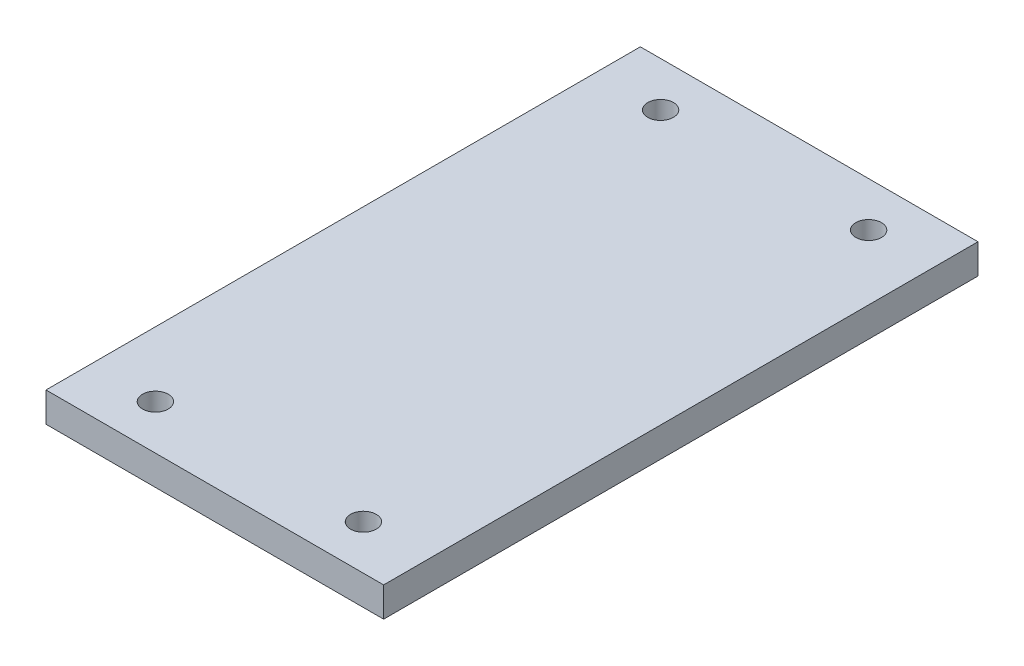
ISO-10303-21;
HEADER;
FILE_DESCRIPTION(('STEP AP214'),'2;1');
FILE_NAME('part.step','',(''),(''),'','','');
FILE_SCHEMA(('AUTOMOTIVE_DESIGN { 1 0 10303 214 1 1 1 1 }'));
ENDSEC;
DATA;
#1=APPLICATION_CONTEXT('core data for automotive mechanical design processes');
#2=APPLICATION_PROTOCOL_DEFINITION('international standard','automotive_design',2000,#1);
#3=PRODUCT_CONTEXT('',#1,'mechanical');
#4=PRODUCT('Part','Part','',(#3));
#5=PRODUCT_RELATED_PRODUCT_CATEGORY('part','',(#4));
#6=PRODUCT_DEFINITION_FORMATION('','',#4);
#7=PRODUCT_DEFINITION_CONTEXT('part definition',#1,'design');
#8=PRODUCT_DEFINITION('design','',#6,#7);
#9=PRODUCT_DEFINITION_SHAPE('','',#8);
#10=(LENGTH_UNIT() NAMED_UNIT(*) SI_UNIT(.MILLI.,.METRE.));
#11=(NAMED_UNIT(*) PLANE_ANGLE_UNIT() SI_UNIT($,.RADIAN.));
#12=(NAMED_UNIT(*) SI_UNIT($,.STERADIAN.) SOLID_ANGLE_UNIT());
#13=UNCERTAINTY_MEASURE_WITH_UNIT(LENGTH_MEASURE(1.E-05),#10,'distance_accuracy_value','');
#14=(GEOMETRIC_REPRESENTATION_CONTEXT(3) GLOBAL_UNCERTAINTY_ASSIGNED_CONTEXT((#13)) GLOBAL_UNIT_ASSIGNED_CONTEXT((#10,
#11,#12)) REPRESENTATION_CONTEXT('',''));
#15=CARTESIAN_POINT('',(0.,0.,0.));
#16=DIRECTION('',(0.,0.,1.));
#17=DIRECTION('',(1.,0.,0.));
#18=AXIS2_PLACEMENT_3D('',#15,#16,#17);
#19=CARTESIAN_POINT('',(36.071859276,6.35,63.5));
#20=DIRECTION('',(-1.,0.,0.));
#21=DIRECTION('',(0.,0.,1.));
#22=AXIS2_PLACEMENT_3D('',#19,#20,#21);
#23=PLANE('',#22);
#24=DIRECTION('',(0.,0.,-1.));
#25=VECTOR('',#24,1.);
#26=CARTESIAN_POINT('',(36.071859276,0.,63.5));
#27=LINE('',#26,#25);
#28=CARTESIAN_POINT('',(36.071859276,0.,63.5));
#29=VERTEX_POINT('',#28);
#30=CARTESIAN_POINT('',(36.071859276,0.,-63.5));
#31=VERTEX_POINT('',#30);
#32=EDGE_CURVE('E100',#29,#31,#27,.T.);
#33=ORIENTED_EDGE('',*,*,#32,.T.);
#34=DIRECTION('',(0.,-1.,0.));
#35=VECTOR('',#34,1.);
#36=CARTESIAN_POINT('',(36.071859276,6.35,-63.5));
#37=LINE('',#36,#35);
#38=CARTESIAN_POINT('',(36.071859276,6.35,-63.5));
#39=VERTEX_POINT('',#38);
#40=EDGE_CURVE('E11',#39,#31,#37,.T.);
#41=ORIENTED_EDGE('',*,*,#40,.F.);
#42=DIRECTION('',(0.,0.,-1.));
#43=VECTOR('',#42,1.);
#44=CARTESIAN_POINT('',(36.071859276,6.35,63.5));
#45=LINE('',#44,#43);
#46=CARTESIAN_POINT('',(36.071859276,6.35,63.5));
#47=VERTEX_POINT('',#46);
#48=EDGE_CURVE('E88',#47,#39,#45,.T.);
#49=ORIENTED_EDGE('',*,*,#48,.F.);
#50=DIRECTION('',(0.,-1.,0.));
#51=VECTOR('',#50,1.);
#52=CARTESIAN_POINT('',(36.071859276,6.35,63.5));
#53=LINE('',#52,#51);
#54=EDGE_CURVE('E96',#47,#29,#53,.T.);
#55=ORIENTED_EDGE('',*,*,#54,.T.);
#56=EDGE_LOOP('',(#33,#41,#49,#55));
#57=FACE_BOUND('',#56,.T.);
#58=ADVANCED_FACE('F37',(#57),#23,.F.);
#59=CARTESIAN_POINT('',(-36.071859276,6.35,-63.5));
#60=DIRECTION('',(0.,0.,1.));
#61=DIRECTION('',(1.,0.,0.));
#62=AXIS2_PLACEMENT_3D('',#59,#60,#61);
#63=PLANE('',#62);
#64=DIRECTION('',(-1.,0.,0.));
#65=VECTOR('',#64,1.);
#66=CARTESIAN_POINT('',(-36.071859276,0.,-63.5));
#67=LINE('',#66,#65);
#68=CARTESIAN_POINT('',(-36.071859276,0.,-63.5));
#69=VERTEX_POINT('',#68);
#70=EDGE_CURVE('E92',#31,#69,#67,.T.);
#71=ORIENTED_EDGE('',*,*,#70,.T.);
#72=DIRECTION('',(0.,-1.,0.));
#73=VECTOR('',#72,1.);
#74=CARTESIAN_POINT('',(-36.071859276,6.35,-63.5));
#75=LINE('',#74,#73);
#76=CARTESIAN_POINT('',(-36.071859276,6.35,-63.5));
#77=VERTEX_POINT('',#76);
#78=EDGE_CURVE('E45',#77,#69,#75,.T.);
#79=ORIENTED_EDGE('',*,*,#78,.F.);
#80=DIRECTION('',(-1.,0.,0.));
#81=VECTOR('',#80,1.);
#82=CARTESIAN_POINT('',(-36.071859276,6.35,-63.5));
#83=LINE('',#82,#81);
#84=EDGE_CURVE('E83',#39,#77,#83,.T.);
#85=ORIENTED_EDGE('',*,*,#84,.F.);
#86=ORIENTED_EDGE('',*,*,#40,.T.);
#87=EDGE_LOOP('',(#71,#79,#85,#86));
#88=FACE_BOUND('',#87,.T.);
#89=ADVANCED_FACE('F91',(#88),#63,.F.);
#90=CARTESIAN_POINT('',(-36.071859276,6.35,63.5));
#91=DIRECTION('',(1.,0.,0.));
#92=DIRECTION('',(0.,0.,-1.));
#93=AXIS2_PLACEMENT_3D('',#90,#91,#92);
#94=PLANE('',#93);
#95=DIRECTION('',(0.,0.,1.));
#96=VECTOR('',#95,1.);
#97=CARTESIAN_POINT('',(-36.071859276,0.,63.5));
#98=LINE('',#97,#96);
#99=CARTESIAN_POINT('',(-36.071859276,0.,63.5));
#100=VERTEX_POINT('',#99);
#101=EDGE_CURVE('E70',#69,#100,#98,.T.);
#102=ORIENTED_EDGE('',*,*,#101,.T.);
#103=DIRECTION('',(0.,-1.,0.));
#104=VECTOR('',#103,1.);
#105=CARTESIAN_POINT('',(-36.071859276,6.35,63.5));
#106=LINE('',#105,#104);
#107=CARTESIAN_POINT('',(-36.071859276,6.35,63.5));
#108=VERTEX_POINT('',#107);
#109=EDGE_CURVE('E93',#108,#100,#106,.T.);
#110=ORIENTED_EDGE('',*,*,#109,.F.);
#111=DIRECTION('',(0.,0.,1.));
#112=VECTOR('',#111,1.);
#113=CARTESIAN_POINT('',(-36.071859276,6.35,63.5));
#114=LINE('',#113,#112);
#115=EDGE_CURVE('E86',#77,#108,#114,.T.);
#116=ORIENTED_EDGE('',*,*,#115,.F.);
#117=ORIENTED_EDGE('',*,*,#78,.T.);
#118=EDGE_LOOP('',(#102,#110,#116,#117));
#119=FACE_BOUND('',#118,.T.);
#120=ADVANCED_FACE('F94',(#119),#94,.F.);
#121=CARTESIAN_POINT('',(-36.071859276,6.35,63.5));
#122=DIRECTION('',(0.,0.,-1.));
#123=DIRECTION('',(-1.,0.,0.));
#124=AXIS2_PLACEMENT_3D('',#121,#122,#123);
#125=PLANE('',#124);
#126=DIRECTION('',(1.,0.,0.));
#127=VECTOR('',#126,1.);
#128=CARTESIAN_POINT('',(-36.071859276,0.,63.5));
#129=LINE('',#128,#127);
#130=EDGE_CURVE('E76',#100,#29,#129,.T.);
#131=ORIENTED_EDGE('',*,*,#130,.T.);
#132=ORIENTED_EDGE('',*,*,#54,.F.);
#133=DIRECTION('',(1.,0.,0.));
#134=VECTOR('',#133,1.);
#135=CARTESIAN_POINT('',(-36.071859276,6.35,63.5));
#136=LINE('',#135,#134);
#137=EDGE_CURVE('E53',#108,#47,#136,.T.);
#138=ORIENTED_EDGE('',*,*,#137,.F.);
#139=ORIENTED_EDGE('',*,*,#109,.T.);
#140=EDGE_LOOP('',(#131,#132,#138,#139));
#141=FACE_BOUND('',#140,.T.);
#142=ADVANCED_FACE('F108',(#141),#125,.F.);
#143=CARTESIAN_POINT('',(0.,6.35,0.));
#144=DIRECTION('',(0.,-1.,0.));
#145=DIRECTION('',(0.,0.,-1.));
#146=AXIS2_PLACEMENT_3D('',#143,#144,#145);
#147=PLANE('',#146);
#148=CARTESIAN_POINT('',(-22.225,6.35,53.975));
#149=DIRECTION('',(0.,1.,0.));
#150=DIRECTION('',(0.,0.,-1.));
#151=AXIS2_PLACEMENT_3D('',#148,#149,#150);
#152=CIRCLE('',#151,2.75);
#153=CARTESIAN_POINT('',(-22.225,6.35,51.225));
#154=VERTEX_POINT('',#153);
#155=EDGE_CURVE('E120',#154,#154,#152,.T.);
#156=ORIENTED_EDGE('',*,*,#155,.F.);
#157=EDGE_LOOP('',(#156));
#158=FACE_BOUND('',#157,.T.);
#159=CARTESIAN_POINT('',(22.225,6.35,53.975));
#160=DIRECTION('',(0.,1.,0.));
#161=DIRECTION('',(0.,0.,1.));
#162=AXIS2_PLACEMENT_3D('',#159,#160,#161);
#163=CIRCLE('',#162,2.75);
#164=CARTESIAN_POINT('',(22.225,6.35,56.725));
#165=VERTEX_POINT('',#164);
#166=EDGE_CURVE('E126',#165,#165,#163,.T.);
#167=ORIENTED_EDGE('',*,*,#166,.F.);
#168=EDGE_LOOP('',(#167));
#169=FACE_BOUND('',#168,.T.);
#170=CARTESIAN_POINT('',(22.225,6.35,-53.975));
#171=DIRECTION('',(0.,1.,0.));
#172=DIRECTION('',(0.,0.,-1.));
#173=AXIS2_PLACEMENT_3D('',#170,#171,#172);
#174=CIRCLE('',#173,2.75);
#175=CARTESIAN_POINT('',(22.225,6.35,-56.725));
#176=VERTEX_POINT('',#175);
#177=EDGE_CURVE('E132',#176,#176,#174,.T.);
#178=ORIENTED_EDGE('',*,*,#177,.F.);
#179=EDGE_LOOP('',(#178));
#180=FACE_BOUND('',#179,.T.);
#181=CARTESIAN_POINT('',(-22.225,6.35,-53.975));
#182=DIRECTION('',(0.,1.,0.));
#183=DIRECTION('',(0.,0.,1.));
#184=AXIS2_PLACEMENT_3D('',#181,#182,#183);
#185=CIRCLE('',#184,2.75);
#186=CARTESIAN_POINT('',(-22.225,6.35,-51.225));
#187=VERTEX_POINT('',#186);
#188=EDGE_CURVE('E114',#187,#187,#185,.T.);
#189=ORIENTED_EDGE('',*,*,#188,.F.);
#190=EDGE_LOOP('',(#189));
#191=FACE_BOUND('',#190,.T.);
#192=ORIENTED_EDGE('',*,*,#48,.T.);
#193=ORIENTED_EDGE('',*,*,#84,.T.);
#194=ORIENTED_EDGE('',*,*,#115,.T.);
#195=ORIENTED_EDGE('',*,*,#137,.T.);
#196=EDGE_LOOP('',(#192,#193,#194,#195));
#197=FACE_BOUND('',#196,.T.);
#198=ADVANCED_FACE('F84',(#158,#169,#180,#191,#197),#147,.F.);
#199=CARTESIAN_POINT('',(0.,0.,0.));
#200=DIRECTION('',(0.,-1.,0.));
#201=DIRECTION('',(0.,0.,-1.));
#202=AXIS2_PLACEMENT_3D('',#199,#200,#201);
#203=PLANE('',#202);
#204=CARTESIAN_POINT('',(-22.225,0.,53.975));
#205=DIRECTION('',(0.,1.,0.));
#206=DIRECTION('',(0.,0.,-1.));
#207=AXIS2_PLACEMENT_3D('',#204,#205,#206);
#208=CIRCLE('',#207,2.75);
#209=CARTESIAN_POINT('',(-22.225,0.,51.225));
#210=VERTEX_POINT('',#209);
#211=EDGE_CURVE('E123',#210,#210,#208,.T.);
#212=ORIENTED_EDGE('',*,*,#211,.T.);
#213=EDGE_LOOP('',(#212));
#214=FACE_BOUND('',#213,.T.);
#215=CARTESIAN_POINT('',(22.225,0.,53.975));
#216=DIRECTION('',(0.,1.,0.));
#217=DIRECTION('',(0.,0.,1.));
#218=AXIS2_PLACEMENT_3D('',#215,#216,#217);
#219=CIRCLE('',#218,2.75);
#220=CARTESIAN_POINT('',(22.225,0.,56.725));
#221=VERTEX_POINT('',#220);
#222=EDGE_CURVE('E129',#221,#221,#219,.T.);
#223=ORIENTED_EDGE('',*,*,#222,.T.);
#224=EDGE_LOOP('',(#223));
#225=FACE_BOUND('',#224,.T.);
#226=CARTESIAN_POINT('',(22.225,0.,-53.975));
#227=DIRECTION('',(0.,1.,0.));
#228=DIRECTION('',(0.,0.,-1.));
#229=AXIS2_PLACEMENT_3D('',#226,#227,#228);
#230=CIRCLE('',#229,2.75);
#231=CARTESIAN_POINT('',(22.225,0.,-56.725));
#232=VERTEX_POINT('',#231);
#233=EDGE_CURVE('E117',#232,#232,#230,.T.);
#234=ORIENTED_EDGE('',*,*,#233,.T.);
#235=EDGE_LOOP('',(#234));
#236=FACE_BOUND('',#235,.T.);
#237=CARTESIAN_POINT('',(-22.225,0.,-53.975));
#238=DIRECTION('',(0.,1.,0.));
#239=DIRECTION('',(0.,0.,1.));
#240=AXIS2_PLACEMENT_3D('',#237,#238,#239);
#241=CIRCLE('',#240,2.75);
#242=CARTESIAN_POINT('',(-22.225,0.,-51.225));
#243=VERTEX_POINT('',#242);
#244=EDGE_CURVE('E103',#243,#243,#241,.T.);
#245=ORIENTED_EDGE('',*,*,#244,.T.);
#246=EDGE_LOOP('',(#245));
#247=FACE_BOUND('',#246,.T.);
#248=ORIENTED_EDGE('',*,*,#32,.F.);
#249=ORIENTED_EDGE('',*,*,#130,.F.);
#250=ORIENTED_EDGE('',*,*,#101,.F.);
#251=ORIENTED_EDGE('',*,*,#70,.F.);
#252=EDGE_LOOP('',(#248,#249,#250,#251));
#253=FACE_BOUND('',#252,.T.);
#254=ADVANCED_FACE('F111',(#214,#225,#236,#247,#253),#203,.T.);
#255=CARTESIAN_POINT('',(-22.225,0.,-53.975));
#256=DIRECTION('',(0.,1.,0.));
#257=DIRECTION('',(0.,0.,1.));
#258=AXIS2_PLACEMENT_3D('',#255,#256,#257);
#259=CYLINDRICAL_SURFACE('',#258,2.75);
#260=ORIENTED_EDGE('',*,*,#244,.F.);
#261=EDGE_LOOP('',(#260));
#262=FACE_BOUND('',#261,.T.);
#263=ORIENTED_EDGE('',*,*,#188,.T.);
#264=EDGE_LOOP('',(#263));
#265=FACE_BOUND('',#264,.T.);
#266=ADVANCED_FACE('F144',(#262,#265),#259,.F.);
#267=CARTESIAN_POINT('',(22.225,0.,-53.975));
#268=DIRECTION('',(0.,1.,0.));
#269=DIRECTION('',(0.,0.,1.));
#270=AXIS2_PLACEMENT_3D('',#267,#268,#269);
#271=CYLINDRICAL_SURFACE('',#270,2.75);
#272=ORIENTED_EDGE('',*,*,#233,.F.);
#273=EDGE_LOOP('',(#272));
#274=FACE_BOUND('',#273,.T.);
#275=ORIENTED_EDGE('',*,*,#177,.T.);
#276=EDGE_LOOP('',(#275));
#277=FACE_BOUND('',#276,.T.);
#278=ADVANCED_FACE('F140',(#274,#277),#271,.F.);
#279=CARTESIAN_POINT('',(22.225,0.,53.975));
#280=DIRECTION('',(0.,1.,0.));
#281=DIRECTION('',(0.,0.,1.));
#282=AXIS2_PLACEMENT_3D('',#279,#280,#281);
#283=CYLINDRICAL_SURFACE('',#282,2.75);
#284=ORIENTED_EDGE('',*,*,#222,.F.);
#285=EDGE_LOOP('',(#284));
#286=FACE_BOUND('',#285,.T.);
#287=ORIENTED_EDGE('',*,*,#166,.T.);
#288=EDGE_LOOP('',(#287));
#289=FACE_BOUND('',#288,.T.);
#290=ADVANCED_FACE('F143',(#286,#289),#283,.F.);
#291=CARTESIAN_POINT('',(-22.225,0.,53.975));
#292=DIRECTION('',(0.,1.,0.));
#293=DIRECTION('',(0.,0.,1.));
#294=AXIS2_PLACEMENT_3D('',#291,#292,#293);
#295=CYLINDRICAL_SURFACE('',#294,2.75);
#296=ORIENTED_EDGE('',*,*,#211,.F.);
#297=EDGE_LOOP('',(#296));
#298=FACE_BOUND('',#297,.T.);
#299=ORIENTED_EDGE('',*,*,#155,.T.);
#300=EDGE_LOOP('',(#299));
#301=FACE_BOUND('',#300,.T.);
#302=ADVANCED_FACE('F208',(#298,#301),#295,.F.);
#303=CLOSED_SHELL('',(#58,#89,#120,#142,#198,#254,#266,#278,#290,#302));
#304=MANIFOLD_SOLID_BREP('B2',#303);
#305=ADVANCED_BREP_SHAPE_REPRESENTATION('',(#18,#304),#14);
#306=SHAPE_DEFINITION_REPRESENTATION(#9,#305);
ENDSEC;
END-ISO-10303-21;
